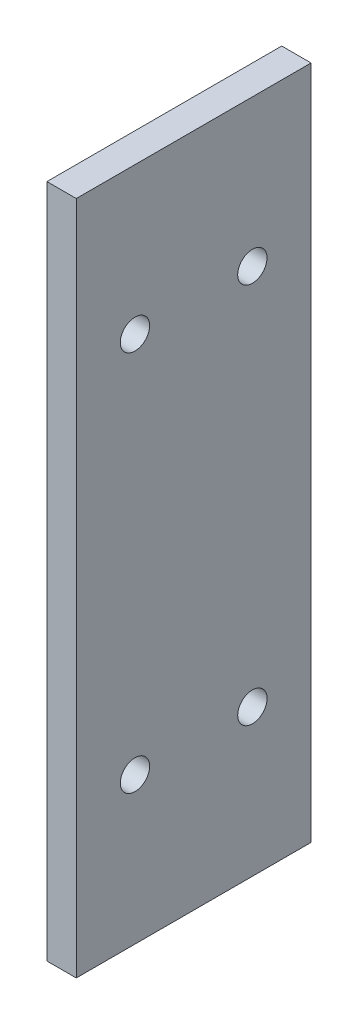
ISO-10303-21;
HEADER;
FILE_DESCRIPTION(('STEP AP214'),'2;1');
FILE_NAME('part.step','',(''),(''),'','','');
FILE_SCHEMA(('AUTOMOTIVE_DESIGN { 1 0 10303 214 1 1 1 1 }'));
ENDSEC;
DATA;
#1=APPLICATION_CONTEXT('core data for automotive mechanical design processes');
#2=APPLICATION_PROTOCOL_DEFINITION('international standard','automotive_design',2000,#1);
#3=PRODUCT_CONTEXT('',#1,'mechanical');
#4=PRODUCT('Part','Part','',(#3));
#5=PRODUCT_RELATED_PRODUCT_CATEGORY('part','',(#4));
#6=PRODUCT_DEFINITION_FORMATION('','',#4);
#7=PRODUCT_DEFINITION_CONTEXT('part definition',#1,'design');
#8=PRODUCT_DEFINITION('design','',#6,#7);
#9=PRODUCT_DEFINITION_SHAPE('','',#8);
#10=(LENGTH_UNIT() NAMED_UNIT(*) SI_UNIT(.MILLI.,.METRE.));
#11=(NAMED_UNIT(*) PLANE_ANGLE_UNIT() SI_UNIT($,.RADIAN.));
#12=(NAMED_UNIT(*) SI_UNIT($,.STERADIAN.) SOLID_ANGLE_UNIT());
#13=UNCERTAINTY_MEASURE_WITH_UNIT(LENGTH_MEASURE(1.E-05),#10,'distance_accuracy_value','');
#14=(GEOMETRIC_REPRESENTATION_CONTEXT(3) GLOBAL_UNCERTAINTY_ASSIGNED_CONTEXT((#13)) GLOBAL_UNIT_ASSIGNED_CONTEXT((#10,
#11,#12)) REPRESENTATION_CONTEXT('',''));
#15=CARTESIAN_POINT('',(0.,0.,0.));
#16=DIRECTION('',(0.,0.,1.));
#17=DIRECTION('',(1.,0.,0.));
#18=AXIS2_PLACEMENT_3D('',#15,#16,#17);
#19=CARTESIAN_POINT('',(5.,0.,0.));
#20=DIRECTION('',(1.,0.,0.));
#21=DIRECTION('',(0.,0.,-1.));
#22=AXIS2_PLACEMENT_3D('',#19,#20,#21);
#23=PLANE('',#22);
#24=CARTESIAN_POINT('',(5.,32.5,-10.));
#25=DIRECTION('',(1.,0.,0.));
#26=DIRECTION('',(0.,0.,-1.));
#27=AXIS2_PLACEMENT_3D('',#24,#25,#26);
#28=CIRCLE('',#27,2.5);
#29=CARTESIAN_POINT('',(5.,32.5,-12.5));
#30=VERTEX_POINT('',#29);
#31=EDGE_CURVE('E127',#30,#30,#28,.T.);
#32=ORIENTED_EDGE('',*,*,#31,.F.);
#33=EDGE_LOOP('',(#32));
#34=FACE_BOUND('',#33,.T.);
#35=CARTESIAN_POINT('',(5.,-32.5,10.));
#36=DIRECTION('',(1.,0.,0.));
#37=DIRECTION('',(0.,0.,-1.));
#38=AXIS2_PLACEMENT_3D('',#35,#36,#37);
#39=CIRCLE('',#38,2.5);
#40=CARTESIAN_POINT('',(5.,-32.5,7.5));
#41=VERTEX_POINT('',#40);
#42=EDGE_CURVE('E106',#41,#41,#39,.T.);
#43=ORIENTED_EDGE('',*,*,#42,.F.);
#44=EDGE_LOOP('',(#43));
#45=FACE_BOUND('',#44,.T.);
#46=DIRECTION('',(0.,0.,-1.));
#47=VECTOR('',#46,1.);
#48=CARTESIAN_POINT('',(5.,-57.5,-20.));
#49=LINE('',#48,#47);
#50=CARTESIAN_POINT('',(5.,-57.5,20.));
#51=VERTEX_POINT('',#50);
#52=CARTESIAN_POINT('',(5.,-57.5,-20.));
#53=VERTEX_POINT('',#52);
#54=EDGE_CURVE('E91',#51,#53,#49,.T.);
#55=ORIENTED_EDGE('',*,*,#54,.T.);
#56=DIRECTION('',(0.,1.,0.));
#57=VECTOR('',#56,1.);
#58=CARTESIAN_POINT('',(5.,57.5,-20.));
#59=LINE('',#58,#57);
#60=CARTESIAN_POINT('',(5.,57.5,-20.));
#61=VERTEX_POINT('',#60);
#62=EDGE_CURVE('E86',#53,#61,#59,.T.);
#63=ORIENTED_EDGE('',*,*,#62,.T.);
#64=DIRECTION('',(0.,0.,1.));
#65=VECTOR('',#64,1.);
#66=CARTESIAN_POINT('',(5.,57.5,-20.));
#67=LINE('',#66,#65);
#68=CARTESIAN_POINT('',(5.,57.5,20.));
#69=VERTEX_POINT('',#68);
#70=EDGE_CURVE('E89',#61,#69,#67,.T.);
#71=ORIENTED_EDGE('',*,*,#70,.T.);
#72=DIRECTION('',(0.,-1.,0.));
#73=VECTOR('',#72,1.);
#74=CARTESIAN_POINT('',(5.,57.5,20.));
#75=LINE('',#74,#73);
#76=EDGE_CURVE('E56',#69,#51,#75,.T.);
#77=ORIENTED_EDGE('',*,*,#76,.T.);
#78=EDGE_LOOP('',(#55,#63,#71,#77));
#79=FACE_BOUND('',#78,.T.);
#80=CARTESIAN_POINT('',(5.,32.5,10.));
#81=DIRECTION('',(1.,0.,0.));
#82=DIRECTION('',(0.,0.,1.));
#83=AXIS2_PLACEMENT_3D('',#80,#81,#82);
#84=CIRCLE('',#83,2.5);
#85=CARTESIAN_POINT('',(5.,32.5,12.5));
#86=VERTEX_POINT('',#85);
#87=EDGE_CURVE('E121',#86,#86,#84,.T.);
#88=ORIENTED_EDGE('',*,*,#87,.F.);
#89=EDGE_LOOP('',(#88));
#90=FACE_BOUND('',#89,.T.);
#91=CARTESIAN_POINT('',(5.,-32.5,-10.));
#92=DIRECTION('',(1.,0.,0.));
#93=DIRECTION('',(0.,0.,1.));
#94=AXIS2_PLACEMENT_3D('',#91,#92,#93);
#95=CIRCLE('',#94,2.5);
#96=CARTESIAN_POINT('',(5.,-32.5,-7.5));
#97=VERTEX_POINT('',#96);
#98=EDGE_CURVE('E133',#97,#97,#95,.T.);
#99=ORIENTED_EDGE('',*,*,#98,.F.);
#100=EDGE_LOOP('',(#99));
#101=FACE_BOUND('',#100,.T.);
#102=ADVANCED_FACE('F39',(#34,#45,#79,#90,#101),#23,.T.);
#103=CARTESIAN_POINT('',(0.,0.,0.));
#104=DIRECTION('',(1.,0.,0.));
#105=DIRECTION('',(0.,0.,-1.));
#106=AXIS2_PLACEMENT_3D('',#103,#104,#105);
#107=PLANE('',#106);
#108=DIRECTION('',(0.,0.,-1.));
#109=VECTOR('',#108,1.);
#110=CARTESIAN_POINT('',(0.,-57.5,-20.));
#111=LINE('',#110,#109);
#112=CARTESIAN_POINT('',(0.,-57.5,20.));
#113=VERTEX_POINT('',#112);
#114=CARTESIAN_POINT('',(0.,-57.5,-20.));
#115=VERTEX_POINT('',#114);
#116=EDGE_CURVE('E103',#113,#115,#111,.T.);
#117=ORIENTED_EDGE('',*,*,#116,.F.);
#118=DIRECTION('',(0.,-1.,0.));
#119=VECTOR('',#118,1.);
#120=CARTESIAN_POINT('',(0.,57.5,20.));
#121=LINE('',#120,#119);
#122=CARTESIAN_POINT('',(0.,57.5,20.));
#123=VERTEX_POINT('',#122);
#124=EDGE_CURVE('E79',#123,#113,#121,.T.);
#125=ORIENTED_EDGE('',*,*,#124,.F.);
#126=DIRECTION('',(0.,0.,1.));
#127=VECTOR('',#126,1.);
#128=CARTESIAN_POINT('',(0.,57.5,-20.));
#129=LINE('',#128,#127);
#130=CARTESIAN_POINT('',(0.,57.5,-20.));
#131=VERTEX_POINT('',#130);
#132=EDGE_CURVE('E73',#131,#123,#129,.T.);
#133=ORIENTED_EDGE('',*,*,#132,.F.);
#134=DIRECTION('',(0.,1.,0.));
#135=VECTOR('',#134,1.);
#136=CARTESIAN_POINT('',(0.,57.5,-20.));
#137=LINE('',#136,#135);
#138=EDGE_CURVE('E95',#115,#131,#137,.T.);
#139=ORIENTED_EDGE('',*,*,#138,.F.);
#140=EDGE_LOOP('',(#117,#125,#133,#139));
#141=FACE_BOUND('',#140,.T.);
#142=CARTESIAN_POINT('',(0.,-32.5,10.));
#143=DIRECTION('',(1.,0.,0.));
#144=DIRECTION('',(0.,0.,-1.));
#145=AXIS2_PLACEMENT_3D('',#142,#143,#144);
#146=CIRCLE('',#145,2.5);
#147=CARTESIAN_POINT('',(0.,-32.5,7.5));
#148=VERTEX_POINT('',#147);
#149=EDGE_CURVE('E118',#148,#148,#146,.T.);
#150=ORIENTED_EDGE('',*,*,#149,.T.);
#151=EDGE_LOOP('',(#150));
#152=FACE_BOUND('',#151,.T.);
#153=CARTESIAN_POINT('',(0.,32.5,10.));
#154=DIRECTION('',(1.,0.,0.));
#155=DIRECTION('',(0.,0.,1.));
#156=AXIS2_PLACEMENT_3D('',#153,#154,#155);
#157=CIRCLE('',#156,2.5);
#158=CARTESIAN_POINT('',(0.,32.5,12.5));
#159=VERTEX_POINT('',#158);
#160=EDGE_CURVE('E124',#159,#159,#157,.T.);
#161=ORIENTED_EDGE('',*,*,#160,.T.);
#162=EDGE_LOOP('',(#161));
#163=FACE_BOUND('',#162,.T.);
#164=CARTESIAN_POINT('',(0.,32.5,-10.));
#165=DIRECTION('',(1.,0.,0.));
#166=DIRECTION('',(0.,0.,-1.));
#167=AXIS2_PLACEMENT_3D('',#164,#165,#166);
#168=CIRCLE('',#167,2.5);
#169=CARTESIAN_POINT('',(0.,32.5,-12.5));
#170=VERTEX_POINT('',#169);
#171=EDGE_CURVE('E130',#170,#170,#168,.T.);
#172=ORIENTED_EDGE('',*,*,#171,.T.);
#173=EDGE_LOOP('',(#172));
#174=FACE_BOUND('',#173,.T.);
#175=CARTESIAN_POINT('',(0.,-32.5,-10.));
#176=DIRECTION('',(1.,0.,0.));
#177=DIRECTION('',(0.,0.,1.));
#178=AXIS2_PLACEMENT_3D('',#175,#176,#177);
#179=CIRCLE('',#178,2.5);
#180=CARTESIAN_POINT('',(0.,-32.5,-7.5));
#181=VERTEX_POINT('',#180);
#182=EDGE_CURVE('E136',#181,#181,#179,.T.);
#183=ORIENTED_EDGE('',*,*,#182,.T.);
#184=EDGE_LOOP('',(#183));
#185=FACE_BOUND('',#184,.T.);
#186=ADVANCED_FACE('F114',(#141,#152,#163,#174,#185),#107,.F.);
#187=CARTESIAN_POINT('',(5.,-57.5,-20.));
#188=DIRECTION('',(0.,1.,0.));
#189=DIRECTION('',(0.,0.,1.));
#190=AXIS2_PLACEMENT_3D('',#187,#188,#189);
#191=PLANE('',#190);
#192=ORIENTED_EDGE('',*,*,#116,.T.);
#193=DIRECTION('',(-1.,0.,0.));
#194=VECTOR('',#193,1.);
#195=CARTESIAN_POINT('',(5.,-57.5,-20.));
#196=LINE('',#195,#194);
#197=EDGE_CURVE('E11',#53,#115,#196,.T.);
#198=ORIENTED_EDGE('',*,*,#197,.F.);
#199=ORIENTED_EDGE('',*,*,#54,.F.);
#200=DIRECTION('',(-1.,0.,0.));
#201=VECTOR('',#200,1.);
#202=CARTESIAN_POINT('',(5.,-57.5,20.));
#203=LINE('',#202,#201);
#204=EDGE_CURVE('E99',#51,#113,#203,.T.);
#205=ORIENTED_EDGE('',*,*,#204,.T.);
#206=EDGE_LOOP('',(#192,#198,#199,#205));
#207=FACE_BOUND('',#206,.T.);
#208=ADVANCED_FACE('F41',(#207),#191,.F.);
#209=CARTESIAN_POINT('',(5.,57.5,-20.));
#210=DIRECTION('',(0.,0.,1.));
#211=DIRECTION('',(0.,-1.,0.));
#212=AXIS2_PLACEMENT_3D('',#209,#210,#211);
#213=PLANE('',#212);
#214=ORIENTED_EDGE('',*,*,#138,.T.);
#215=DIRECTION('',(-1.,0.,0.));
#216=VECTOR('',#215,1.);
#217=CARTESIAN_POINT('',(5.,57.5,-20.));
#218=LINE('',#217,#216);
#219=EDGE_CURVE('E48',#61,#131,#218,.T.);
#220=ORIENTED_EDGE('',*,*,#219,.F.);
#221=ORIENTED_EDGE('',*,*,#62,.F.);
#222=ORIENTED_EDGE('',*,*,#197,.T.);
#223=EDGE_LOOP('',(#214,#220,#221,#222));
#224=FACE_BOUND('',#223,.T.);
#225=ADVANCED_FACE('F94',(#224),#213,.F.);
#226=CARTESIAN_POINT('',(5.,57.5,-20.));
#227=DIRECTION('',(0.,-1.,0.));
#228=DIRECTION('',(0.,0.,-1.));
#229=AXIS2_PLACEMENT_3D('',#226,#227,#228);
#230=PLANE('',#229);
#231=ORIENTED_EDGE('',*,*,#132,.T.);
#232=DIRECTION('',(-1.,0.,0.));
#233=VECTOR('',#232,1.);
#234=CARTESIAN_POINT('',(5.,57.5,20.));
#235=LINE('',#234,#233);
#236=EDGE_CURVE('E96',#69,#123,#235,.T.);
#237=ORIENTED_EDGE('',*,*,#236,.F.);
#238=ORIENTED_EDGE('',*,*,#70,.F.);
#239=ORIENTED_EDGE('',*,*,#219,.T.);
#240=EDGE_LOOP('',(#231,#237,#238,#239));
#241=FACE_BOUND('',#240,.T.);
#242=ADVANCED_FACE('F97',(#241),#230,.F.);
#243=CARTESIAN_POINT('',(5.,57.5,20.));
#244=DIRECTION('',(0.,0.,-1.));
#245=DIRECTION('',(0.,1.,0.));
#246=AXIS2_PLACEMENT_3D('',#243,#244,#245);
#247=PLANE('',#246);
#248=ORIENTED_EDGE('',*,*,#124,.T.);
#249=ORIENTED_EDGE('',*,*,#204,.F.);
#250=ORIENTED_EDGE('',*,*,#76,.F.);
#251=ORIENTED_EDGE('',*,*,#236,.T.);
#252=EDGE_LOOP('',(#248,#249,#250,#251));
#253=FACE_BOUND('',#252,.T.);
#254=ADVANCED_FACE('F111',(#253),#247,.F.);
#255=CARTESIAN_POINT('',(5.,-32.5,10.));
#256=DIRECTION('',(-1.,0.,0.));
#257=DIRECTION('',(0.,0.,1.));
#258=AXIS2_PLACEMENT_3D('',#255,#256,#257);
#259=CYLINDRICAL_SURFACE('',#258,2.5);
#260=ORIENTED_EDGE('',*,*,#42,.T.);
#261=EDGE_LOOP('',(#260));
#262=FACE_BOUND('',#261,.T.);
#263=ORIENTED_EDGE('',*,*,#149,.F.);
#264=EDGE_LOOP('',(#263));
#265=FACE_BOUND('',#264,.T.);
#266=ADVANCED_FACE('F155',(#262,#265),#259,.F.);
#267=CARTESIAN_POINT('',(5.,32.5,10.));
#268=DIRECTION('',(-1.,0.,0.));
#269=DIRECTION('',(0.,0.,1.));
#270=AXIS2_PLACEMENT_3D('',#267,#268,#269);
#271=CYLINDRICAL_SURFACE('',#270,2.5);
#272=ORIENTED_EDGE('',*,*,#87,.T.);
#273=EDGE_LOOP('',(#272));
#274=FACE_BOUND('',#273,.T.);
#275=ORIENTED_EDGE('',*,*,#160,.F.);
#276=EDGE_LOOP('',(#275));
#277=FACE_BOUND('',#276,.T.);
#278=ADVANCED_FACE('F200',(#274,#277),#271,.F.);
#279=CARTESIAN_POINT('',(5.,32.5,-10.));
#280=DIRECTION('',(-1.,0.,0.));
#281=DIRECTION('',(0.,0.,1.));
#282=AXIS2_PLACEMENT_3D('',#279,#280,#281);
#283=CYLINDRICAL_SURFACE('',#282,2.5);
#284=ORIENTED_EDGE('',*,*,#31,.T.);
#285=EDGE_LOOP('',(#284));
#286=FACE_BOUND('',#285,.T.);
#287=ORIENTED_EDGE('',*,*,#171,.F.);
#288=EDGE_LOOP('',(#287));
#289=FACE_BOUND('',#288,.T.);
#290=ADVANCED_FACE('F208',(#286,#289),#283,.F.);
#291=CARTESIAN_POINT('',(5.,-32.5,-10.));
#292=DIRECTION('',(-1.,0.,0.));
#293=DIRECTION('',(0.,0.,1.));
#294=AXIS2_PLACEMENT_3D('',#291,#292,#293);
#295=CYLINDRICAL_SURFACE('',#294,2.5);
#296=ORIENTED_EDGE('',*,*,#98,.T.);
#297=EDGE_LOOP('',(#296));
#298=FACE_BOUND('',#297,.T.);
#299=ORIENTED_EDGE('',*,*,#182,.F.);
#300=EDGE_LOOP('',(#299));
#301=FACE_BOUND('',#300,.T.);
#302=ADVANCED_FACE('F142',(#298,#301),#295,.F.);
#303=CLOSED_SHELL('',(#102,#186,#208,#225,#242,#254,#266,#278,#290,#302));
#304=MANIFOLD_SOLID_BREP('B2',#303);
#305=ADVANCED_BREP_SHAPE_REPRESENTATION('',(#18,#304),#14);
#306=SHAPE_DEFINITION_REPRESENTATION(#9,#305);
ENDSEC;
END-ISO-10303-21;
